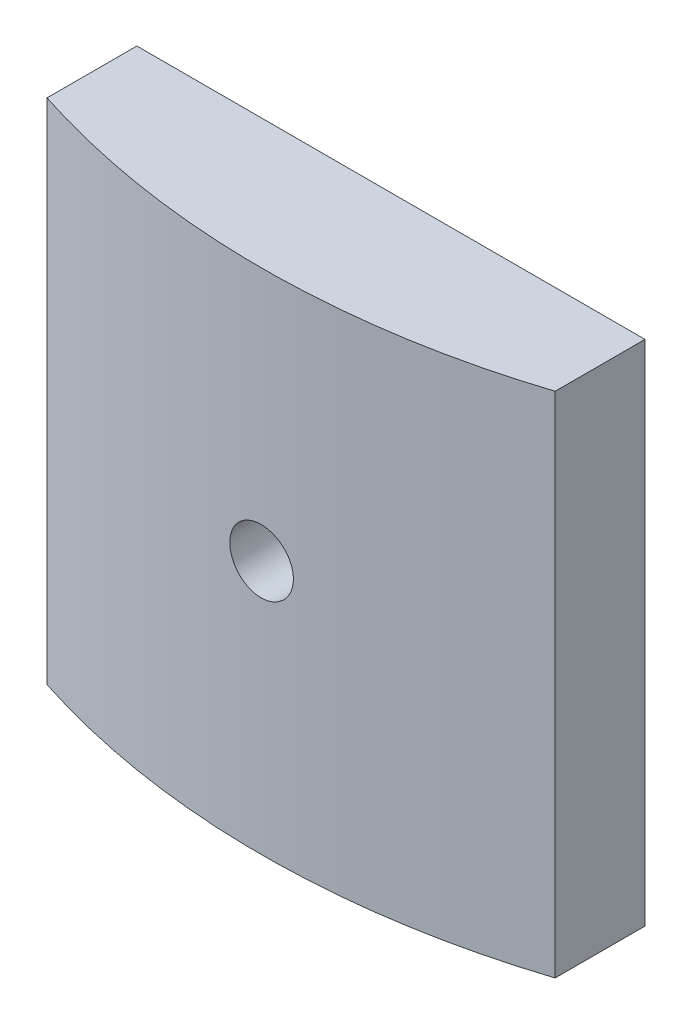
ISO-10303-21;
HEADER;
FILE_DESCRIPTION(('STEP AP214'),'2;1');
FILE_NAME('part.step','',(''),(''),'','','');
FILE_SCHEMA(('AUTOMOTIVE_DESIGN { 1 0 10303 214 1 1 1 1 }'));
ENDSEC;
DATA;
#1=APPLICATION_CONTEXT('core data for automotive mechanical design processes');
#2=APPLICATION_PROTOCOL_DEFINITION('international standard','automotive_design',2000,#1);
#3=PRODUCT_CONTEXT('',#1,'mechanical');
#4=PRODUCT('Part','Part','',(#3));
#5=PRODUCT_RELATED_PRODUCT_CATEGORY('part','',(#4));
#6=PRODUCT_DEFINITION_FORMATION('','',#4);
#7=PRODUCT_DEFINITION_CONTEXT('part definition',#1,'design');
#8=PRODUCT_DEFINITION('design','',#6,#7);
#9=PRODUCT_DEFINITION_SHAPE('','',#8);
#10=(LENGTH_UNIT() NAMED_UNIT(*) SI_UNIT(.MILLI.,.METRE.));
#11=(NAMED_UNIT(*) PLANE_ANGLE_UNIT() SI_UNIT($,.RADIAN.));
#12=(NAMED_UNIT(*) SI_UNIT($,.STERADIAN.) SOLID_ANGLE_UNIT());
#13=UNCERTAINTY_MEASURE_WITH_UNIT(LENGTH_MEASURE(1.E-05),#10,'distance_accuracy_value','');
#14=(GEOMETRIC_REPRESENTATION_CONTEXT(3) GLOBAL_UNCERTAINTY_ASSIGNED_CONTEXT((#13)) GLOBAL_UNIT_ASSIGNED_CONTEXT((#10,
#11,#12)) REPRESENTATION_CONTEXT('',''));
#15=CARTESIAN_POINT('',(0.,0.,0.));
#16=DIRECTION('',(0.,0.,1.));
#17=DIRECTION('',(1.,0.,0.));
#18=AXIS2_PLACEMENT_3D('',#15,#16,#17);
#19=CARTESIAN_POINT('',(0.,20.,27.3861278752583));
#20=DIRECTION('',(0.,0.,1.));
#21=DIRECTION('',(1.,0.,0.));
#22=AXIS2_PLACEMENT_3D('',#19,#20,#21);
#23=PLANE('',#22);
#24=CARTESIAN_POINT('',(0.,10.,27.3861278752583));
#25=DIRECTION('',(0.,0.,-1.));
#26=DIRECTION('',(-1.,0.,0.));
#27=AXIS2_PLACEMENT_3D('',#24,#25,#26);
#28=CIRCLE('',#27,1.25);
#29=CARTESIAN_POINT('',(-1.25,10.,27.3861278752583));
#30=VERTEX_POINT('',#29);
#31=EDGE_CURVE('E143',#30,#30,#28,.T.);
#32=ORIENTED_EDGE('',*,*,#31,.F.);
#33=EDGE_LOOP('',(#32));
#34=FACE_BOUND('',#33,.T.);
#35=DIRECTION('',(-1.,0.,0.));
#36=VECTOR('',#35,1.);
#37=CARTESIAN_POINT('',(0.,0.,27.3861278752583));
#38=LINE('',#37,#36);
#39=CARTESIAN_POINT('',(10.,0.,27.3861278752583));
#40=VERTEX_POINT('',#39);
#41=CARTESIAN_POINT('',(-10.,0.,27.3861278752583));
#42=VERTEX_POINT('',#41);
#43=EDGE_CURVE('E80',#40,#42,#38,.T.);
#44=ORIENTED_EDGE('',*,*,#43,.T.);
#45=DIRECTION('',(0.,-1.,0.));
#46=VECTOR('',#45,1.);
#47=CARTESIAN_POINT('',(-10.,20.,27.3861278752583));
#48=LINE('',#47,#46);
#49=CARTESIAN_POINT('',(-10.,20.,27.3861278752583));
#50=VERTEX_POINT('',#49);
#51=EDGE_CURVE('E11',#50,#42,#48,.T.);
#52=ORIENTED_EDGE('',*,*,#51,.F.);
#53=DIRECTION('',(1.,0.,0.));
#54=VECTOR('',#53,1.);
#55=CARTESIAN_POINT('',(0.,20.,27.3861278752583));
#56=LINE('',#55,#54);
#57=CARTESIAN_POINT('',(10.,20.,27.3861278752583));
#58=VERTEX_POINT('',#57);
#59=EDGE_CURVE('E58',#50,#58,#56,.T.);
#60=ORIENTED_EDGE('',*,*,#59,.T.);
#61=DIRECTION('',(0.,-1.,0.));
#62=VECTOR('',#61,1.);
#63=CARTESIAN_POINT('',(10.,20.,27.3861278752583));
#64=LINE('',#63,#62);
#65=EDGE_CURVE('E86',#58,#40,#64,.T.);
#66=ORIENTED_EDGE('',*,*,#65,.T.);
#67=EDGE_LOOP('',(#44,#52,#60,#66));
#68=FACE_BOUND('',#67,.T.);
#69=ADVANCED_FACE('F35',(#34,#68),#23,.F.);
#70=CARTESIAN_POINT('',(-10.,20.,27.3861278752583));
#71=DIRECTION('',(1.,0.,0.));
#72=DIRECTION('',(0.,0.,-1.));
#73=AXIS2_PLACEMENT_3D('',#70,#71,#72);
#74=PLANE('',#73);
#75=DIRECTION('',(0.,0.,1.));
#76=VECTOR('',#75,1.);
#77=CARTESIAN_POINT('',(-10.,0.,27.3861278752583));
#78=LINE('',#77,#76);
#79=CARTESIAN_POINT('',(-10.,0.,30.9232921921325));
#80=VERTEX_POINT('',#79);
#81=EDGE_CURVE('E74',#42,#80,#78,.T.);
#82=ORIENTED_EDGE('',*,*,#81,.T.);
#83=DIRECTION('',(0.,-1.,0.));
#84=VECTOR('',#83,1.);
#85=CARTESIAN_POINT('',(-10.,20.,30.9232921921325));
#86=LINE('',#85,#84);
#87=CARTESIAN_POINT('',(-10.,20.,30.9232921921325));
#88=VERTEX_POINT('',#87);
#89=EDGE_CURVE('E49',#88,#80,#86,.T.);
#90=ORIENTED_EDGE('',*,*,#89,.F.);
#91=DIRECTION('',(0.,0.,1.));
#92=VECTOR('',#91,1.);
#93=CARTESIAN_POINT('',(-10.,20.,27.3861278752583));
#94=LINE('',#93,#92);
#95=EDGE_CURVE('E94',#50,#88,#94,.T.);
#96=ORIENTED_EDGE('',*,*,#95,.F.);
#97=ORIENTED_EDGE('',*,*,#51,.T.);
#98=EDGE_LOOP('',(#82,#90,#96,#97));
#99=FACE_BOUND('',#98,.T.);
#100=ADVANCED_FACE('F127',(#99),#74,.F.);
#101=CARTESIAN_POINT('',(0.,20.,0.));
#102=DIRECTION('',(0.,-1.,0.));
#103=DIRECTION('',(0.,0.,-1.));
#104=AXIS2_PLACEMENT_3D('',#101,#102,#103);
#105=CYLINDRICAL_SURFACE('',#104,32.5);
#106=CARTESIAN_POINT('',(-1.25,10.,32.4759526419165));
#107=CARTESIAN_POINT('',(-1.24999689617086,10.0701851827879,32.4759529658739));
#108=CARTESIAN_POINT('',(-1.24406900225156,10.1404205955136,32.4761826067936));
#109=CARTESIAN_POINT('',(-1.22050478860525,10.2789551893929,32.4770765574977));
#110=CARTESIAN_POINT('',(-1.2028545519778,10.3472519683611,32.477741383926));
#111=CARTESIAN_POINT('',(-1.15635057294687,10.4798823507921,32.4794302846548));
#112=CARTESIAN_POINT('',(-1.12750239480982,10.5442179042242,32.4804541805092));
#113=CARTESIAN_POINT('',(-1.05942961463461,10.6671154049648,32.4827456205276));
#114=CARTESIAN_POINT('',(-1.02020751527047,10.7256787401308,32.4840131059064));
#115=CARTESIAN_POINT('',(-0.93247086636134,10.8354257211982,32.4866498669461));
#116=CARTESIAN_POINT('',(-0.883951062229511,10.8866051652952,32.488019199897));
#117=CARTESIAN_POINT('',(-0.779006218549471,10.9800959576271,32.490704803323));
#118=CARTESIAN_POINT('',(-0.722580861512346,11.0224069495324,32.4920210716645));
#119=CARTESIAN_POINT('',(-0.603407476309236,11.0969691210003,32.4944525588159));
#120=CARTESIAN_POINT('',(-0.540657609823968,11.1292173644438,32.4955677189063));
#121=CARTESIAN_POINT('',(-0.410629456786084,11.1827196842019,32.4974707769042));
#122=CARTESIAN_POINT('',(-0.343351194219294,11.2039738187444,32.4982586765451));
#123=CARTESIAN_POINT('',(-0.206211608976743,11.234874418965,32.4994180567741));
#124=CARTESIAN_POINT('',(-0.136351592632901,11.244526674343,32.4997897450585));
#125=CARTESIAN_POINT('',(0.00399808472642147,11.251967377111,32.5000755051786));
#126=CARTESIAN_POINT('',(0.0744877423428182,11.2497558885082,32.4999895794833));
#127=CARTESIAN_POINT('',(0.214056552812057,11.2335367223368,32.4993699726658));
#128=CARTESIAN_POINT('',(0.283136431958526,11.2195352843566,32.4988365283842));
#129=CARTESIAN_POINT('',(0.417964519250023,11.1801433308364,32.4973822651489));
#130=CARTESIAN_POINT('',(0.483712717650964,11.154752781989,32.4964614450624));
#131=CARTESIAN_POINT('',(0.610031193661735,11.0932962069853,32.4943357823857));
#132=CARTESIAN_POINT('',(0.670600081604664,11.0572273272247,32.4931308638926));
#133=CARTESIAN_POINT('',(0.784825393716484,10.9754400547605,32.4905727600801));
#134=CARTESIAN_POINT('',(0.838481790126008,10.929721623308,32.4892195741652));
#135=CARTESIAN_POINT('',(0.937395387244155,10.8298977255654,32.4865163605639));
#136=CARTESIAN_POINT('',(0.982647125396518,10.7757868462831,32.4851663354906));
#137=CARTESIAN_POINT('',(1.06342481230432,10.6607331242545,32.4826225266119));
#138=CARTESIAN_POINT('',(1.09895075916127,10.5997902801746,32.4814287428371));
#139=CARTESIAN_POINT('',(1.15926786239988,10.4727994164173,32.4793320952058));
#140=CARTESIAN_POINT('',(1.18405883138207,10.4067513076415,32.478429236428));
#141=CARTESIAN_POINT('',(1.22219869039351,10.2714262051816,32.4770164532601));
#142=CARTESIAN_POINT('',(1.23554763143643,10.2021492258946,32.4765065271181));
#143=CARTESIAN_POINT('',(1.25041778518814,10.0623804498626,32.4759374295629));
#144=CARTESIAN_POINT('',(1.25194657097326,9.99188945994766,32.4758779695402));
#145=CARTESIAN_POINT('',(1.24315276279892,9.85165187263613,32.4762157559307));
#146=CARTESIAN_POINT('',(1.2328301917767,9.78190527379913,32.47661300146));
#147=CARTESIAN_POINT('',(1.20063296529249,9.64515750136255,32.4778191572837));
#148=CARTESIAN_POINT('',(1.17876176040017,9.57815551415167,32.4786279446127));
#149=CARTESIAN_POINT('',(1.12409160476723,9.44877389306616,32.4805659111062));
#150=CARTESIAN_POINT('',(1.09129261704996,9.38639427483325,32.481695091355));
#151=CARTESIAN_POINT('',(1.01567844868846,9.26799325144983,32.4841472638625));
#152=CARTESIAN_POINT('',(0.972858172195892,9.21197510271761,32.4854703545969));
#153=CARTESIAN_POINT('',(0.87842440511864,9.10791989492929,32.4881608570178));
#154=CARTESIAN_POINT('',(0.826810879890412,9.0598828673186,32.489528268879));
#155=CARTESIAN_POINT('',(0.716223264105315,8.97312815666355,32.4921541164302));
#156=CARTESIAN_POINT('',(0.657245338946221,8.93441535967867,32.4934124947646));
#157=CARTESIAN_POINT('',(0.53362257416487,8.86744142080113,32.495677617463));
#158=CARTESIAN_POINT('',(0.468977751640052,8.83918024737649,32.4966843625862));
#159=CARTESIAN_POINT('',(0.335874554186006,8.79392035336655,32.4983324676924));
#160=CARTESIAN_POINT('',(0.26741725193575,8.77691848204724,32.4989739298868));
#161=CARTESIAN_POINT('',(0.128617228882613,8.75464948728974,32.4998195719176));
#162=CARTESIAN_POINT('',(0.0582745129830178,8.74938233333674,32.5000237528912));
#163=CARTESIAN_POINT('',(-0.082250900423072,8.75073264233291,32.4999718250677));
#164=CARTESIAN_POINT('',(-0.152433671984188,8.75734242350584,32.4997160137849));
#165=CARTESIAN_POINT('',(-0.290692492993776,8.78224313947101,32.4987735009887));
#166=CARTESIAN_POINT('',(-0.358768538332624,8.80053409704839,32.4980867986347));
#167=CARTESIAN_POINT('',(-0.49088367257949,8.84827660378945,32.4963598189079));
#168=CARTESIAN_POINT('',(-0.554922704197674,8.87772831129533,32.4953195365187));
#169=CARTESIAN_POINT('',(-0.677146647122759,8.94695444435945,32.4930025307253));
#170=CARTESIAN_POINT('',(-0.735331758421968,8.98672851709993,32.4917258154028));
#171=CARTESIAN_POINT('',(-0.844233380284909,9.07549596073847,32.489078842432));
#172=CARTESIAN_POINT('',(-0.894945844589979,9.12449429388732,32.487708534689));
#173=CARTESIAN_POINT('',(-0.987439715648728,9.23032346620305,32.4850290142729));
#174=CARTESIAN_POINT('',(-1.02921891303176,9.28715623727593,32.483719816776));
#175=CARTESIAN_POINT('',(-1.10267187866228,9.40707132525039,32.4813095579576));
#176=CARTESIAN_POINT('',(-1.13433794153071,9.47015835965973,32.480208655599));
#177=CARTESIAN_POINT('',(-1.18659152455102,9.60070955436403,32.4783418703975));
#178=CARTESIAN_POINT('',(-1.20719221031758,9.66816840543561,32.477575589625));
#179=CARTESIAN_POINT('',(-1.23129103188108,9.78004240254275,32.476668591131));
#180=CARTESIAN_POINT('',(-1.23829802039761,9.82373192782734,32.4764012829635));
#181=CARTESIAN_POINT('',(-1.24765348078242,9.91160765998234,32.4760432063774));
#182=CARTESIAN_POINT('',(-1.25000195494661,9.95579386660795,32.4759524378719));
#183=CARTESIAN_POINT('',(-1.25,10.,32.4759526419165));
#184=B_SPLINE_CURVE_WITH_KNOTS('',3,(#106,#107,#108,#109,#110,#111,#112,#113,#114,#115,#116,
#117,#118,#119,#120,#121,#122,#123,#124,#125,#126,#127,#128,#129,#130,#131,#132,#133,#134,#135,
#136,#137,#138,#139,#140,#141,#142,#143,#144,#145,#146,#147,#148,#149,#150,#151,#152,#153,#154,
#155,#156,#157,#158,#159,#160,#161,#162,#163,#164,#165,#166,#167,#168,#169,#170,#171,#172,#173,
#174,#175,#176,#177,#178,#179,#180,#181,#182,#183),.UNSPECIFIED.,.T.,.F.,(4,2,2,2,2,2,2,2,2,2,2,
2,2,2,2,2,2,2,2,2,2,2,2,2,2,2,2,2,2,2,2,2,2,2,2,2,2,2,4),(0.,0.21039418618625,0.421038602350701,
0.631578482843503,0.842067617545127,1.05267606264722,1.26329296826107,1.4739712705526,
1.68464845701954,1.89522046528475,2.10579133747488,2.31625083934584,2.52671095670707,
2.73722736683658,2.94774462233706,3.15839822706801,3.36905187291891,3.57970919598207,
3.79036557983601,4.00088698668293,4.21140798608503,4.42186612033055,4.63232496671648,
4.84289106533558,5.05345799355998,5.26413502362913,5.47481141809228,5.68542883322637,
5.89604570067312,6.10652639415671,6.31700749820227,6.52749158854284,6.7379684854982,
6.94855893510812,7.15920140774275,7.37000399188224,7.58055520383713,7.71307203536495,
7.84558880158286),.UNSPECIFIED.);
#185=CARTESIAN_POINT('',(-1.25,10.,32.4759526419165));
#186=VERTEX_POINT('',#185);
#187=EDGE_CURVE('E39',#186,#186,#184,.T.);
#188=ORIENTED_EDGE('',*,*,#187,.T.);
#189=EDGE_LOOP('',(#188));
#190=FACE_BOUND('',#189,.T.);
#191=CARTESIAN_POINT('',(0.,0.,0.));
#192=DIRECTION('',(0.,1.,0.));
#193=DIRECTION('',(0.,0.,1.));
#194=AXIS2_PLACEMENT_3D('',#191,#192,#193);
#195=CIRCLE('',#194,32.5);
#196=CARTESIAN_POINT('',(9.99999999999999,0.,30.9232921921325));
#197=VERTEX_POINT('',#196);
#198=EDGE_CURVE('E101',#80,#197,#195,.T.);
#199=ORIENTED_EDGE('',*,*,#198,.T.);
#200=DIRECTION('',(0.,-1.,0.));
#201=VECTOR('',#200,1.);
#202=CARTESIAN_POINT('',(9.99999999999999,20.,30.9232921921325));
#203=LINE('',#202,#201);
#204=CARTESIAN_POINT('',(9.99999999999999,20.,30.9232921921325));
#205=VERTEX_POINT('',#204);
#206=EDGE_CURVE('E98',#205,#197,#203,.T.);
#207=ORIENTED_EDGE('',*,*,#206,.F.);
#208=CARTESIAN_POINT('',(0.,20.,0.));
#209=DIRECTION('',(0.,1.,0.));
#210=DIRECTION('',(0.,0.,1.));
#211=AXIS2_PLACEMENT_3D('',#208,#209,#210);
#212=CIRCLE('',#211,32.5);
#213=EDGE_CURVE('E89',#88,#205,#212,.T.);
#214=ORIENTED_EDGE('',*,*,#213,.F.);
#215=ORIENTED_EDGE('',*,*,#89,.T.);
#216=EDGE_LOOP('',(#199,#207,#214,#215));
#217=FACE_BOUND('',#216,.T.);
#218=ADVANCED_FACE('F99',(#190,#217),#105,.T.);
#219=CARTESIAN_POINT('',(10.,20.,27.3861278752583));
#220=DIRECTION('',(1.,0.,0.));
#221=DIRECTION('',(0.,0.,-1.));
#222=AXIS2_PLACEMENT_3D('',#219,#220,#221);
#223=PLANE('',#222);
#224=DIRECTION('',(0.,0.,1.));
#225=VECTOR('',#224,1.);
#226=CARTESIAN_POINT('',(10.,0.,27.3861278752583));
#227=LINE('',#226,#225);
#228=EDGE_CURVE('E109',#40,#197,#227,.T.);
#229=ORIENTED_EDGE('',*,*,#228,.F.);
#230=ORIENTED_EDGE('',*,*,#65,.F.);
#231=DIRECTION('',(0.,0.,1.));
#232=VECTOR('',#231,1.);
#233=CARTESIAN_POINT('',(10.,20.,27.3861278752583));
#234=LINE('',#233,#232);
#235=EDGE_CURVE('E92',#58,#205,#234,.T.);
#236=ORIENTED_EDGE('',*,*,#235,.T.);
#237=ORIENTED_EDGE('',*,*,#206,.T.);
#238=EDGE_LOOP('',(#229,#230,#236,#237));
#239=FACE_BOUND('',#238,.T.);
#240=ADVANCED_FACE('F37',(#239),#223,.T.);
#241=CARTESIAN_POINT('',(0.,20.,0.));
#242=DIRECTION('',(0.,1.,0.));
#243=DIRECTION('',(0.,0.,1.));
#244=AXIS2_PLACEMENT_3D('',#241,#242,#243);
#245=PLANE('',#244);
#246=ORIENTED_EDGE('',*,*,#59,.F.);
#247=ORIENTED_EDGE('',*,*,#95,.T.);
#248=ORIENTED_EDGE('',*,*,#213,.T.);
#249=ORIENTED_EDGE('',*,*,#235,.F.);
#250=EDGE_LOOP('',(#246,#247,#248,#249));
#251=FACE_BOUND('',#250,.T.);
#252=ADVANCED_FACE('F91',(#251),#245,.T.);
#253=CARTESIAN_POINT('',(0.,0.,0.));
#254=DIRECTION('',(0.,1.,0.));
#255=DIRECTION('',(0.,0.,1.));
#256=AXIS2_PLACEMENT_3D('',#253,#254,#255);
#257=PLANE('',#256);
#258=ORIENTED_EDGE('',*,*,#43,.F.);
#259=ORIENTED_EDGE('',*,*,#228,.T.);
#260=ORIENTED_EDGE('',*,*,#198,.F.);
#261=ORIENTED_EDGE('',*,*,#81,.F.);
#262=EDGE_LOOP('',(#258,#259,#260,#261));
#263=FACE_BOUND('',#262,.T.);
#264=ADVANCED_FACE('F115',(#263),#257,.F.);
#265=CARTESIAN_POINT('',(0.,10.,47.3861278752583));
#266=DIRECTION('',(0.,0.,-1.));
#267=DIRECTION('',(-1.,0.,0.));
#268=AXIS2_PLACEMENT_3D('',#265,#266,#267);
#269=CYLINDRICAL_SURFACE('',#268,1.25);
#270=ORIENTED_EDGE('',*,*,#31,.T.);
#271=EDGE_LOOP('',(#270));
#272=FACE_BOUND('',#271,.T.);
#273=ORIENTED_EDGE('',*,*,#187,.F.);
#274=EDGE_LOOP('',(#273));
#275=FACE_BOUND('',#274,.T.);
#276=ADVANCED_FACE('F117',(#272,#275),#269,.F.);
#277=CLOSED_SHELL('',(#69,#100,#218,#240,#252,#264,#276));
#278=MANIFOLD_SOLID_BREP('B2',#277);
#279=ADVANCED_BREP_SHAPE_REPRESENTATION('',(#18,#278),#14);
#280=SHAPE_DEFINITION_REPRESENTATION(#9,#279);
ENDSEC;
END-ISO-10303-21;
